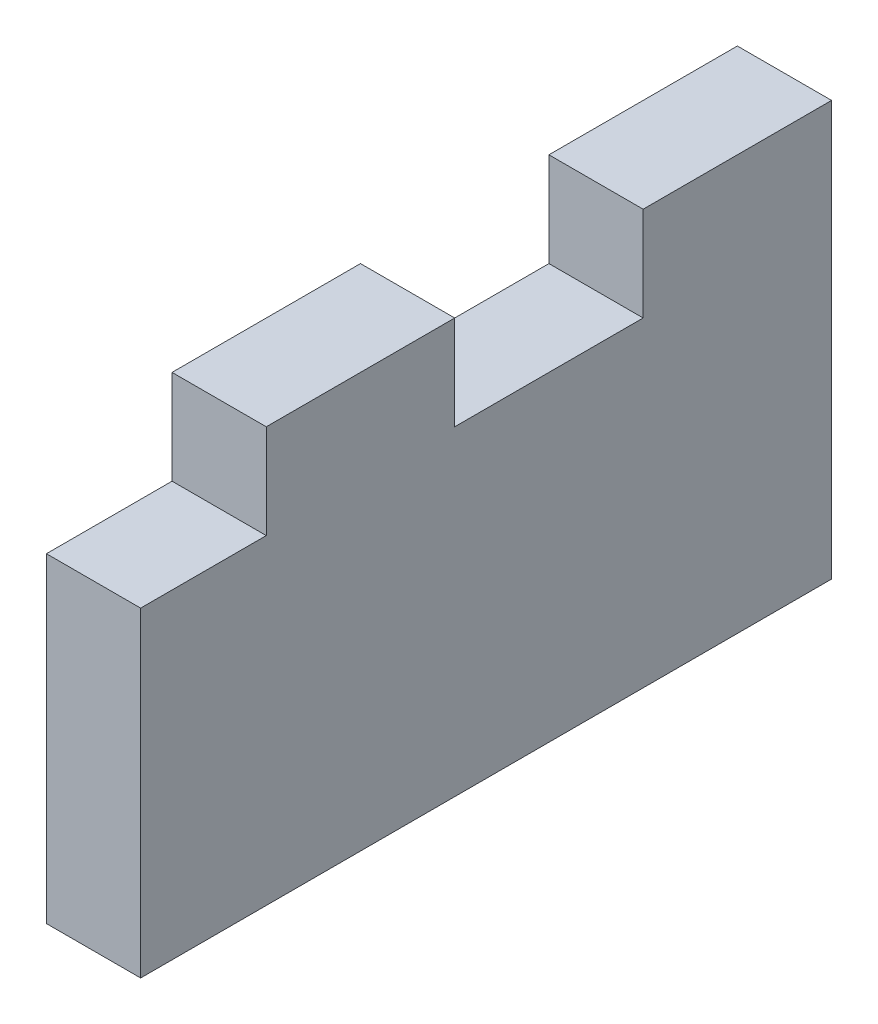
ISO-10303-21;
HEADER;
FILE_DESCRIPTION(('STEP AP214'),'2;1');
FILE_NAME('part.step','',(''),(''),'','','');
FILE_SCHEMA(('AUTOMOTIVE_DESIGN { 1 0 10303 214 1 1 1 1 }'));
ENDSEC;
DATA;
#1=APPLICATION_CONTEXT('core data for automotive mechanical design processes');
#2=APPLICATION_PROTOCOL_DEFINITION('international standard','automotive_design',2000,#1);
#3=PRODUCT_CONTEXT('',#1,'mechanical');
#4=PRODUCT('Part','Part','',(#3));
#5=PRODUCT_RELATED_PRODUCT_CATEGORY('part','',(#4));
#6=PRODUCT_DEFINITION_FORMATION('','',#4);
#7=PRODUCT_DEFINITION_CONTEXT('part definition',#1,'design');
#8=PRODUCT_DEFINITION('design','',#6,#7);
#9=PRODUCT_DEFINITION_SHAPE('','',#8);
#10=(LENGTH_UNIT() NAMED_UNIT(*) SI_UNIT(.MILLI.,.METRE.));
#11=(NAMED_UNIT(*) PLANE_ANGLE_UNIT() SI_UNIT($,.RADIAN.));
#12=(NAMED_UNIT(*) SI_UNIT($,.STERADIAN.) SOLID_ANGLE_UNIT());
#13=UNCERTAINTY_MEASURE_WITH_UNIT(LENGTH_MEASURE(1.E-05),#10,'distance_accuracy_value','');
#14=(GEOMETRIC_REPRESENTATION_CONTEXT(3) GLOBAL_UNCERTAINTY_ASSIGNED_CONTEXT((#13)) GLOBAL_UNIT_ASSIGNED_CONTEXT((#10,
#11,#12)) REPRESENTATION_CONTEXT('',''));
#15=CARTESIAN_POINT('',(0.,0.,0.));
#16=DIRECTION('',(0.,0.,1.));
#17=DIRECTION('',(1.,0.,0.));
#18=AXIS2_PLACEMENT_3D('',#15,#16,#17);
#19=CARTESIAN_POINT('',(9.525,-1.11022302462515E-13,-50.7999999999999));
#20=DIRECTION('',(0.,0.,1.));
#21=DIRECTION('',(0.,-1.,0.));
#22=AXIS2_PLACEMENT_3D('',#19,#20,#21);
#23=PLANE('',#22);
#24=DIRECTION('',(0.,1.,0.));
#25=VECTOR('',#24,1.);
#26=CARTESIAN_POINT('',(0.,-1.11022302462515E-13,-50.7999999999999));
#27=LINE('',#26,#25);
#28=CARTESIAN_POINT('',(0.,32.385,-50.8));
#29=VERTEX_POINT('',#28);
#30=CARTESIAN_POINT('',(0.,41.91,-50.8));
#31=VERTEX_POINT('',#30);
#32=EDGE_CURVE('E152',#29,#31,#27,.T.);
#33=ORIENTED_EDGE('',*,*,#32,.F.);
#34=DIRECTION('',(-1.,0.,0.));
#35=VECTOR('',#34,1.);
#36=CARTESIAN_POINT('',(9.525,32.385,-50.8));
#37=LINE('',#36,#35);
#38=CARTESIAN_POINT('',(9.525,32.385,-50.8));
#39=VERTEX_POINT('',#38);
#40=EDGE_CURVE('E11',#39,#29,#37,.T.);
#41=ORIENTED_EDGE('',*,*,#40,.F.);
#42=DIRECTION('',(0.,1.,0.));
#43=VECTOR('',#42,1.);
#44=CARTESIAN_POINT('',(9.525,-1.11022302462515E-13,-50.7999999999999));
#45=LINE('',#44,#43);
#46=CARTESIAN_POINT('',(9.525,41.91,-50.8));
#47=VERTEX_POINT('',#46);
#48=EDGE_CURVE('E222',#39,#47,#45,.T.);
#49=ORIENTED_EDGE('',*,*,#48,.T.);
#50=DIRECTION('',(-1.,0.,0.));
#51=VECTOR('',#50,1.);
#52=CARTESIAN_POINT('',(9.525,41.91,-50.8));
#53=LINE('',#52,#51);
#54=EDGE_CURVE('E58',#47,#31,#53,.T.);
#55=ORIENTED_EDGE('',*,*,#54,.T.);
#56=EDGE_LOOP('',(#33,#41,#49,#55));
#57=FACE_BOUND('',#56,.T.);
#58=ADVANCED_FACE('F41',(#57),#23,.T.);
#59=CARTESIAN_POINT('',(9.525,32.385,0.));
#60=DIRECTION('',(0.,1.,0.));
#61=DIRECTION('',(0.,0.,1.));
#62=AXIS2_PLACEMENT_3D('',#59,#60,#61);
#63=PLANE('',#62);
#64=DIRECTION('',(0.,0.,-1.));
#65=VECTOR('',#64,1.);
#66=CARTESIAN_POINT('',(0.,32.385,0.));
#67=LINE('',#66,#65);
#68=CARTESIAN_POINT('',(0.,32.385,-31.75));
#69=VERTEX_POINT('',#68);
#70=EDGE_CURVE('E155',#69,#29,#67,.T.);
#71=ORIENTED_EDGE('',*,*,#70,.F.);
#72=DIRECTION('',(-1.,0.,0.));
#73=VECTOR('',#72,1.);
#74=CARTESIAN_POINT('',(9.525,32.385,-31.75));
#75=LINE('',#74,#73);
#76=CARTESIAN_POINT('',(9.525,32.385,-31.75));
#77=VERTEX_POINT('',#76);
#78=EDGE_CURVE('E50',#77,#69,#75,.T.);
#79=ORIENTED_EDGE('',*,*,#78,.F.);
#80=DIRECTION('',(0.,0.,-1.));
#81=VECTOR('',#80,1.);
#82=CARTESIAN_POINT('',(9.525,32.385,0.));
#83=LINE('',#82,#81);
#84=EDGE_CURVE('E218',#77,#39,#83,.T.);
#85=ORIENTED_EDGE('',*,*,#84,.T.);
#86=ORIENTED_EDGE('',*,*,#40,.T.);
#87=EDGE_LOOP('',(#71,#79,#85,#86));
#88=FACE_BOUND('',#87,.T.);
#89=ADVANCED_FACE('F217',(#88),#63,.T.);
#90=CARTESIAN_POINT('',(9.525,0.,-31.7499999999999));
#91=DIRECTION('',(0.,0.,1.));
#92=DIRECTION('',(0.,-1.,0.));
#93=AXIS2_PLACEMENT_3D('',#90,#91,#92);
#94=PLANE('',#93);
#95=DIRECTION('',(0.,1.,0.));
#96=VECTOR('',#95,1.);
#97=CARTESIAN_POINT('',(0.,0.,-31.7499999999999));
#98=LINE('',#97,#96);
#99=CARTESIAN_POINT('',(0.,41.91,-31.75));
#100=VERTEX_POINT('',#99);
#101=EDGE_CURVE('E159',#69,#100,#98,.T.);
#102=ORIENTED_EDGE('',*,*,#101,.T.);
#103=DIRECTION('',(-1.,0.,0.));
#104=VECTOR('',#103,1.);
#105=CARTESIAN_POINT('',(9.525,41.91,-31.75));
#106=LINE('',#105,#104);
#107=CARTESIAN_POINT('',(9.525,41.91,-31.75));
#108=VERTEX_POINT('',#107);
#109=EDGE_CURVE('E200',#108,#100,#106,.T.);
#110=ORIENTED_EDGE('',*,*,#109,.F.);
#111=DIRECTION('',(0.,1.,0.));
#112=VECTOR('',#111,1.);
#113=CARTESIAN_POINT('',(9.525,0.,-31.7499999999999));
#114=LINE('',#113,#112);
#115=EDGE_CURVE('E208',#77,#108,#114,.T.);
#116=ORIENTED_EDGE('',*,*,#115,.F.);
#117=ORIENTED_EDGE('',*,*,#78,.T.);
#118=EDGE_LOOP('',(#102,#110,#116,#117));
#119=FACE_BOUND('',#118,.T.);
#120=ADVANCED_FACE('F206',(#119),#94,.F.);
#121=CARTESIAN_POINT('',(9.525,41.91,0.));
#122=DIRECTION('',(0.,1.,0.));
#123=DIRECTION('',(0.,0.,1.));
#124=AXIS2_PLACEMENT_3D('',#121,#122,#123);
#125=PLANE('',#124);
#126=DIRECTION('',(0.,0.,-1.));
#127=VECTOR('',#126,1.);
#128=CARTESIAN_POINT('',(0.,41.91,0.));
#129=LINE('',#128,#127);
#130=CARTESIAN_POINT('',(0.,41.91,-12.7));
#131=VERTEX_POINT('',#130);
#132=EDGE_CURVE('E163',#131,#100,#129,.T.);
#133=ORIENTED_EDGE('',*,*,#132,.F.);
#134=DIRECTION('',(-1.,0.,0.));
#135=VECTOR('',#134,1.);
#136=CARTESIAN_POINT('',(9.525,41.91,-12.7));
#137=LINE('',#136,#135);
#138=CARTESIAN_POINT('',(9.525,41.91,-12.7));
#139=VERTEX_POINT('',#138);
#140=EDGE_CURVE('E197',#139,#131,#137,.T.);
#141=ORIENTED_EDGE('',*,*,#140,.F.);
#142=DIRECTION('',(0.,0.,-1.));
#143=VECTOR('',#142,1.);
#144=CARTESIAN_POINT('',(9.525,41.91,0.));
#145=LINE('',#144,#143);
#146=EDGE_CURVE('E149',#139,#108,#145,.T.);
#147=ORIENTED_EDGE('',*,*,#146,.T.);
#148=ORIENTED_EDGE('',*,*,#109,.T.);
#149=EDGE_LOOP('',(#133,#141,#147,#148));
#150=FACE_BOUND('',#149,.T.);
#151=ADVANCED_FACE('F251',(#150),#125,.T.);
#152=CARTESIAN_POINT('',(9.525,0.,-12.7));
#153=DIRECTION('',(0.,0.,-1.));
#154=DIRECTION('',(0.,1.,0.));
#155=AXIS2_PLACEMENT_3D('',#152,#153,#154);
#156=PLANE('',#155);
#157=DIRECTION('',(0.,-1.,0.));
#158=VECTOR('',#157,1.);
#159=CARTESIAN_POINT('',(0.,0.,-12.7));
#160=LINE('',#159,#158);
#161=CARTESIAN_POINT('',(0.,32.385,-12.7));
#162=VERTEX_POINT('',#161);
#163=EDGE_CURVE('E167',#131,#162,#160,.T.);
#164=ORIENTED_EDGE('',*,*,#163,.T.);
#165=DIRECTION('',(-1.,0.,0.));
#166=VECTOR('',#165,1.);
#167=CARTESIAN_POINT('',(9.525,32.385,-12.7));
#168=LINE('',#167,#166);
#169=CARTESIAN_POINT('',(9.525,32.385,-12.7));
#170=VERTEX_POINT('',#169);
#171=EDGE_CURVE('E194',#170,#162,#168,.T.);
#172=ORIENTED_EDGE('',*,*,#171,.F.);
#173=DIRECTION('',(0.,-1.,0.));
#174=VECTOR('',#173,1.);
#175=CARTESIAN_POINT('',(9.525,0.,-12.7));
#176=LINE('',#175,#174);
#177=EDGE_CURVE('E232',#139,#170,#176,.T.);
#178=ORIENTED_EDGE('',*,*,#177,.F.);
#179=ORIENTED_EDGE('',*,*,#140,.T.);
#180=EDGE_LOOP('',(#164,#172,#178,#179));
#181=FACE_BOUND('',#180,.T.);
#182=ADVANCED_FACE('F248',(#181),#156,.F.);
#183=CARTESIAN_POINT('',(9.525,32.385,0.));
#184=DIRECTION('',(0.,1.,0.));
#185=DIRECTION('',(0.,0.,1.));
#186=AXIS2_PLACEMENT_3D('',#183,#184,#185);
#187=PLANE('',#186);
#188=DIRECTION('',(0.,0.,-1.));
#189=VECTOR('',#188,1.);
#190=CARTESIAN_POINT('',(0.,32.385,0.));
#191=LINE('',#190,#189);
#192=CARTESIAN_POINT('',(0.,32.385,0.));
#193=VERTEX_POINT('',#192);
#194=EDGE_CURVE('E172',#193,#162,#191,.T.);
#195=ORIENTED_EDGE('',*,*,#194,.F.);
#196=DIRECTION('',(-1.,0.,0.));
#197=VECTOR('',#196,1.);
#198=CARTESIAN_POINT('',(9.525,32.385,0.));
#199=LINE('',#198,#197);
#200=CARTESIAN_POINT('',(9.525,32.385,0.));
#201=VERTEX_POINT('',#200);
#202=EDGE_CURVE('E191',#201,#193,#199,.T.);
#203=ORIENTED_EDGE('',*,*,#202,.F.);
#204=DIRECTION('',(0.,0.,-1.));
#205=VECTOR('',#204,1.);
#206=CARTESIAN_POINT('',(9.525,32.385,0.));
#207=LINE('',#206,#205);
#208=EDGE_CURVE('E235',#201,#170,#207,.T.);
#209=ORIENTED_EDGE('',*,*,#208,.T.);
#210=ORIENTED_EDGE('',*,*,#171,.T.);
#211=EDGE_LOOP('',(#195,#203,#209,#210));
#212=FACE_BOUND('',#211,.T.);
#213=ADVANCED_FACE('F244',(#212),#187,.T.);
#214=CARTESIAN_POINT('',(9.525,0.,0.));
#215=DIRECTION('',(0.,0.,1.));
#216=DIRECTION('',(0.,-1.,0.));
#217=AXIS2_PLACEMENT_3D('',#214,#215,#216);
#218=PLANE('',#217);
#219=DIRECTION('',(0.,1.,0.));
#220=VECTOR('',#219,1.);
#221=CARTESIAN_POINT('',(0.,0.,0.));
#222=LINE('',#221,#220);
#223=CARTESIAN_POINT('',(0.,0.,0.));
#224=VERTEX_POINT('',#223);
#225=EDGE_CURVE('E176',#224,#193,#222,.T.);
#226=ORIENTED_EDGE('',*,*,#225,.F.);
#227=DIRECTION('',(-1.,0.,0.));
#228=VECTOR('',#227,1.);
#229=CARTESIAN_POINT('',(9.525,0.,0.));
#230=LINE('',#229,#228);
#231=CARTESIAN_POINT('',(9.525,0.,0.));
#232=VERTEX_POINT('',#231);
#233=EDGE_CURVE('E141',#232,#224,#230,.T.);
#234=ORIENTED_EDGE('',*,*,#233,.F.);
#235=DIRECTION('',(0.,1.,0.));
#236=VECTOR('',#235,1.);
#237=CARTESIAN_POINT('',(9.525,0.,0.));
#238=LINE('',#237,#236);
#239=EDGE_CURVE('E129',#232,#201,#238,.T.);
#240=ORIENTED_EDGE('',*,*,#239,.T.);
#241=ORIENTED_EDGE('',*,*,#202,.T.);
#242=EDGE_LOOP('',(#226,#234,#240,#241));
#243=FACE_BOUND('',#242,.T.);
#244=ADVANCED_FACE('F241',(#243),#218,.T.);
#245=CARTESIAN_POINT('',(9.525,0.,0.));
#246=DIRECTION('',(0.,1.,0.));
#247=DIRECTION('',(0.,0.,1.));
#248=AXIS2_PLACEMENT_3D('',#245,#246,#247);
#249=PLANE('',#248);
#250=DIRECTION('',(0.,0.,-1.));
#251=VECTOR('',#250,1.);
#252=CARTESIAN_POINT('',(0.,0.,0.));
#253=LINE('',#252,#251);
#254=CARTESIAN_POINT('',(0.,0.,-69.85));
#255=VERTEX_POINT('',#254);
#256=EDGE_CURVE('E137',#224,#255,#253,.T.);
#257=ORIENTED_EDGE('',*,*,#256,.T.);
#258=DIRECTION('',(-1.,0.,0.));
#259=VECTOR('',#258,1.);
#260=CARTESIAN_POINT('',(9.525,0.,-69.85));
#261=LINE('',#260,#259);
#262=CARTESIAN_POINT('',(9.525,0.,-69.85));
#263=VERTEX_POINT('',#262);
#264=EDGE_CURVE('E134',#263,#255,#261,.T.);
#265=ORIENTED_EDGE('',*,*,#264,.F.);
#266=DIRECTION('',(0.,0.,-1.));
#267=VECTOR('',#266,1.);
#268=CARTESIAN_POINT('',(9.525,0.,0.));
#269=LINE('',#268,#267);
#270=EDGE_CURVE('E121',#232,#263,#269,.T.);
#271=ORIENTED_EDGE('',*,*,#270,.F.);
#272=ORIENTED_EDGE('',*,*,#233,.T.);
#273=EDGE_LOOP('',(#257,#265,#271,#272));
#274=FACE_BOUND('',#273,.T.);
#275=ADVANCED_FACE('F135',(#274),#249,.F.);
#276=CARTESIAN_POINT('',(9.525,0.,-69.85));
#277=DIRECTION('',(0.,0.,1.));
#278=DIRECTION('',(1.,0.,0.));
#279=AXIS2_PLACEMENT_3D('',#276,#277,#278);
#280=PLANE('',#279);
#281=DIRECTION('',(0.,1.,0.));
#282=VECTOR('',#281,1.);
#283=CARTESIAN_POINT('',(0.,0.,-69.85));
#284=LINE('',#283,#282);
#285=CARTESIAN_POINT('',(0.,41.91,-69.85));
#286=VERTEX_POINT('',#285);
#287=EDGE_CURVE('E182',#255,#286,#284,.T.);
#288=ORIENTED_EDGE('',*,*,#287,.T.);
#289=DIRECTION('',(-1.,0.,0.));
#290=VECTOR('',#289,1.);
#291=CARTESIAN_POINT('',(9.525,41.91,-69.85));
#292=LINE('',#291,#290);
#293=CARTESIAN_POINT('',(9.525,41.91,-69.85));
#294=VERTEX_POINT('',#293);
#295=EDGE_CURVE('E90',#294,#286,#292,.T.);
#296=ORIENTED_EDGE('',*,*,#295,.F.);
#297=DIRECTION('',(0.,1.,0.));
#298=VECTOR('',#297,1.);
#299=CARTESIAN_POINT('',(9.525,0.,-69.85));
#300=LINE('',#299,#298);
#301=EDGE_CURVE('E126',#263,#294,#300,.T.);
#302=ORIENTED_EDGE('',*,*,#301,.F.);
#303=ORIENTED_EDGE('',*,*,#264,.T.);
#304=EDGE_LOOP('',(#288,#296,#302,#303));
#305=FACE_BOUND('',#304,.T.);
#306=ADVANCED_FACE('F143',(#305),#280,.F.);
#307=EDGE_CURVE('E168',#31,#286,#129,.T.);
#308=ORIENTED_EDGE('',*,*,#307,.F.);
#309=ORIENTED_EDGE('',*,*,#54,.F.);
#310=EDGE_CURVE('E145',#47,#294,#145,.T.);
#311=ORIENTED_EDGE('',*,*,#310,.T.);
#312=ORIENTED_EDGE('',*,*,#295,.T.);
#313=EDGE_LOOP('',(#308,#309,#311,#312));
#314=FACE_BOUND('',#313,.T.);
#315=ADVANCED_FACE('F220',(#314),#125,.T.);
#316=CARTESIAN_POINT('',(9.525,0.,0.));
#317=DIRECTION('',(1.,0.,0.));
#318=DIRECTION('',(0.,0.,-1.));
#319=AXIS2_PLACEMENT_3D('',#316,#317,#318);
#320=PLANE('',#319);
#321=ORIENTED_EDGE('',*,*,#48,.F.);
#322=ORIENTED_EDGE('',*,*,#84,.F.);
#323=ORIENTED_EDGE('',*,*,#115,.T.);
#324=ORIENTED_EDGE('',*,*,#146,.F.);
#325=ORIENTED_EDGE('',*,*,#177,.T.);
#326=ORIENTED_EDGE('',*,*,#208,.F.);
#327=ORIENTED_EDGE('',*,*,#239,.F.);
#328=ORIENTED_EDGE('',*,*,#270,.T.);
#329=ORIENTED_EDGE('',*,*,#301,.T.);
#330=ORIENTED_EDGE('',*,*,#310,.F.);
#331=EDGE_LOOP('',(#321,#322,#323,#324,#325,#326,#327,#328,#329,#330));
#332=FACE_BOUND('',#331,.T.);
#333=ADVANCED_FACE('F123',(#332),#320,.T.);
#334=CARTESIAN_POINT('',(0.,0.,0.));
#335=DIRECTION('',(1.,0.,0.));
#336=DIRECTION('',(0.,0.,-1.));
#337=AXIS2_PLACEMENT_3D('',#334,#335,#336);
#338=PLANE('',#337);
#339=ORIENTED_EDGE('',*,*,#32,.T.);
#340=ORIENTED_EDGE('',*,*,#307,.T.);
#341=ORIENTED_EDGE('',*,*,#287,.F.);
#342=ORIENTED_EDGE('',*,*,#256,.F.);
#343=ORIENTED_EDGE('',*,*,#225,.T.);
#344=ORIENTED_EDGE('',*,*,#194,.T.);
#345=ORIENTED_EDGE('',*,*,#163,.F.);
#346=ORIENTED_EDGE('',*,*,#132,.T.);
#347=ORIENTED_EDGE('',*,*,#101,.F.);
#348=ORIENTED_EDGE('',*,*,#70,.T.);
#349=EDGE_LOOP('',(#339,#340,#341,#342,#343,#344,#345,#346,#347,#348));
#350=FACE_BOUND('',#349,.T.);
#351=ADVANCED_FACE('F214',(#350),#338,.F.);
#352=CLOSED_SHELL('',(#58,#89,#120,#151,#182,#213,#244,#275,#306,#315,#333,#351));
#353=MANIFOLD_SOLID_BREP('B2',#352);
#354=ADVANCED_BREP_SHAPE_REPRESENTATION('',(#18,#353),#14);
#355=SHAPE_DEFINITION_REPRESENTATION(#9,#354);
ENDSEC;
END-ISO-10303-21;
